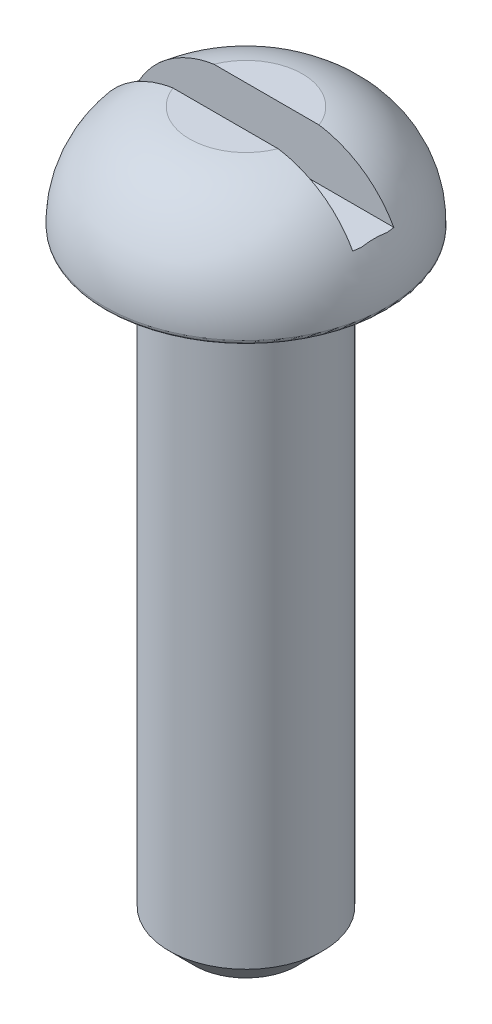
ISO-10303-21;
HEADER;
FILE_DESCRIPTION(('STEP AP214'),'2;1');
FILE_NAME('part.step','',(''),(''),'','','');
FILE_SCHEMA(('AUTOMOTIVE_DESIGN { 1 0 10303 214 1 1 1 1 }'));
ENDSEC;
DATA;
#1=APPLICATION_CONTEXT('core data for automotive mechanical design processes');
#2=APPLICATION_PROTOCOL_DEFINITION('international standard','automotive_design',2000,#1);
#3=PRODUCT_CONTEXT('',#1,'mechanical');
#4=PRODUCT('Part','Part','',(#3));
#5=PRODUCT_RELATED_PRODUCT_CATEGORY('part','',(#4));
#6=PRODUCT_DEFINITION_FORMATION('','',#4);
#7=PRODUCT_DEFINITION_CONTEXT('part definition',#1,'design');
#8=PRODUCT_DEFINITION('design','',#6,#7);
#9=PRODUCT_DEFINITION_SHAPE('','',#8);
#10=(LENGTH_UNIT() NAMED_UNIT(*) SI_UNIT(.MILLI.,.METRE.));
#11=(NAMED_UNIT(*) PLANE_ANGLE_UNIT() SI_UNIT($,.RADIAN.));
#12=(NAMED_UNIT(*) SI_UNIT($,.STERADIAN.) SOLID_ANGLE_UNIT());
#13=UNCERTAINTY_MEASURE_WITH_UNIT(LENGTH_MEASURE(1.E-05),#10,'distance_accuracy_value','');
#14=(GEOMETRIC_REPRESENTATION_CONTEXT(3) GLOBAL_UNCERTAINTY_ASSIGNED_CONTEXT((#13)) GLOBAL_UNIT_ASSIGNED_CONTEXT((#10,
#11,#12)) REPRESENTATION_CONTEXT('',''));
#15=CARTESIAN_POINT('',(0.,0.,0.));
#16=DIRECTION('',(0.,0.,1.));
#17=DIRECTION('',(1.,0.,0.));
#18=AXIS2_PLACEMENT_3D('',#15,#16,#17);
#19=CARTESIAN_POINT('',(0.,14.,0.));
#20=DIRECTION('',(0.,1.,0.));
#21=DIRECTION('',(0.,0.,1.));
#22=AXIS2_PLACEMENT_3D('',#19,#20,#21);
#23=PLANE('',#22);
#24=DIRECTION('',(-1.,0.,0.));
#25=VECTOR('',#24,1.);
#26=CARTESIAN_POINT('',(-2.5,14.,-0.4));
#27=LINE('',#26,#25);
#28=CARTESIAN_POINT('',(1.02469507659595,14.,-0.4));
#29=VERTEX_POINT('',#28);
#30=CARTESIAN_POINT('',(-1.02469507659595,14.,-0.4));
#31=VERTEX_POINT('',#30);
#32=EDGE_CURVE('E95',#29,#31,#27,.T.);
#33=ORIENTED_EDGE('',*,*,#32,.F.);
#34=CARTESIAN_POINT('',(0.,14.,0.));
#35=DIRECTION('',(0.,-1.,0.));
#36=DIRECTION('',(0.,0.,-1.));
#37=AXIS2_PLACEMENT_3D('',#34,#35,#36);
#38=CIRCLE('',#37,1.1);
#39=EDGE_CURVE('E101',#31,#29,#38,.T.);
#40=ORIENTED_EDGE('',*,*,#39,.F.);
#41=EDGE_LOOP('',(#33,#40));
#42=FACE_BOUND('',#41,.T.);
#43=ADVANCED_FACE('F29',(#42),#23,.T.);
#44=CARTESIAN_POINT('',(1.,0.,0.));
#45=DIRECTION('',(0.,-1.,0.));
#46=DIRECTION('',(0.,0.,-1.));
#47=AXIS2_PLACEMENT_3D('',#44,#45,#46);
#48=PLANE('',#47);
#49=CARTESIAN_POINT('',(0.,0.,0.));
#50=DIRECTION('',(0.,-1.,0.));
#51=DIRECTION('',(0.,0.,-1.));
#52=AXIS2_PLACEMENT_3D('',#49,#50,#51);
#53=CIRCLE('',#52,1.);
#54=CARTESIAN_POINT('',(0.,0.,-1.));
#55=VERTEX_POINT('',#54);
#56=EDGE_CURVE('E223',#55,#55,#53,.T.);
#57=ORIENTED_EDGE('',*,*,#56,.T.);
#58=EDGE_LOOP('',(#57));
#59=FACE_BOUND('',#58,.T.);
#60=ADVANCED_FACE('F31',(#59),#48,.T.);
#61=DIRECTION('',(1.,0.,0.));
#62=VECTOR('',#61,1.);
#63=CARTESIAN_POINT('',(-2.5,14.,0.4));
#64=LINE('',#63,#62);
#65=CARTESIAN_POINT('',(-1.02469507659595,14.,0.4));
#66=VERTEX_POINT('',#65);
#67=CARTESIAN_POINT('',(1.02469507659595,14.,0.4));
#68=VERTEX_POINT('',#67);
#69=EDGE_CURVE('E87',#66,#68,#64,.T.);
#70=ORIENTED_EDGE('',*,*,#69,.F.);
#71=EDGE_CURVE('E94',#68,#66,#38,.T.);
#72=ORIENTED_EDGE('',*,*,#71,.F.);
#73=EDGE_LOOP('',(#70,#72));
#74=FACE_BOUND('',#73,.T.);
#75=ADVANCED_FACE('F93',(#74),#23,.T.);
#76=CARTESIAN_POINT('',(0.,12.050099776341,0.));
#77=DIRECTION('',(0.,-1.,0.));
#78=DIRECTION('',(0.,0.,-1.));
#79=AXIS2_PLACEMENT_3D('',#76,#77,#78);
#80=DEGENERATE_TOROIDAL_SURFACE('',#79,0.779672442615777,1.97603659537097,.T.);
#81=CARTESIAN_POINT('',(0.,13.9893185526949,0.4));
#82=CARTESIAN_POINT('',(0.0336322301279483,13.9893205716001,0.4));
#83=CARTESIAN_POINT('',(0.0672648143564293,13.9901784468217,0.4));
#84=CARTESIAN_POINT('',(0.134486048973814,13.9932787408374,0.4));
#85=CARTESIAN_POINT('',(0.168074638300507,13.9955223279096,0.4));
#86=CARTESIAN_POINT('',(0.235341692539278,14.000675588183,0.4));
#87=CARTESIAN_POINT('',(0.269019918116884,14.0035880994358,0.4));
#88=CARTESIAN_POINT('',(0.336378018840054,14.0093648088338,0.4));
#89=CARTESIAN_POINT('',(0.370057893639487,14.0122290108159,0.4));
#90=CARTESIAN_POINT('',(0.437877287244912,14.0174111816535,0.4));
#91=CARTESIAN_POINT('',(0.472017389468459,14.0197220409397,0.4));
#92=CARTESIAN_POINT('',(0.540348220697959,14.0233824621022,0.4));
#93=CARTESIAN_POINT('',(0.574538947867759,14.024732058027,0.4));
#94=CARTESIAN_POINT('',(0.677147719963299,14.0269491128557,0.4));
#95=CARTESIAN_POINT('',(0.745623445649574,14.0259868039846,0.4));
#96=CARTESIAN_POINT('',(0.881972396232885,14.0181001103437,0.4));
#97=CARTESIAN_POINT('',(0.949846939653068,14.0112000935624,0.4));
#98=CARTESIAN_POINT('',(1.08464932382839,13.991052747799,0.4));
#99=CARTESIAN_POINT('',(1.1515770535867,13.9778046808679,0.4));
#100=CARTESIAN_POINT('',(1.32743905883569,13.9338998713499,0.4));
#101=CARTESIAN_POINT('',(1.43501246700903,13.8975241731368,0.4));
#102=CARTESIAN_POINT('',(1.64277375092832,13.8071409643015,0.4));
#103=CARTESIAN_POINT('',(1.74294278143891,13.7530902425877,0.4));
#104=CARTESIAN_POINT('',(1.93265776354999,13.6286817859467,0.4));
#105=CARTESIAN_POINT('',(2.02220009208707,13.5583185134356,0.4));
#106=CARTESIAN_POINT('',(2.18779655682164,13.4033275008754,0.4));
#107=CARTESIAN_POINT('',(2.26386325268286,13.3187131882393,0.4));
#108=CARTESIAN_POINT('',(2.39887936251544,13.1395132914902,0.4));
#109=CARTESIAN_POINT('',(2.4581485407167,13.0451684721683,0.4));
#110=CARTESIAN_POINT('',(2.55988756159558,12.8477855070151,0.4));
#111=CARTESIAN_POINT('',(2.60235359515437,12.7447453964566,0.4));
#112=CARTESIAN_POINT('',(2.66896720325158,12.5337422855212,0.4));
#113=CARTESIAN_POINT('',(2.69324730817994,12.4258211017661,0.4));
#114=CARTESIAN_POINT('',(2.72329499940504,12.2074482378214,0.4));
#115=CARTESIAN_POINT('',(2.72906565960174,12.096996980875,0.4));
#116=CARTESIAN_POINT('',(2.72194370625239,11.8769623688357,0.4));
#117=CARTESIAN_POINT('',(2.70909546504866,11.7673775740258,0.4));
#118=CARTESIAN_POINT('',(2.66518054080641,11.5518857114062,0.4));
#119=CARTESIAN_POINT('',(2.63410816106256,11.4459798045542,0.4));
#120=CARTESIAN_POINT('',(2.55461964830542,11.2408306457122,0.4));
#121=CARTESIAN_POINT('',(2.50619477197843,11.1415907824946,0.4));
#122=CARTESIAN_POINT('',(2.39346155608862,10.952730884082,0.4));
#123=CARTESIAN_POINT('',(2.32917055267638,10.8631005013887,0.4));
#124=CARTESIAN_POINT('',(2.18644835327305,10.6957164743583,0.4));
#125=CARTESIAN_POINT('',(2.10799740164992,10.6179797073024,0.4));
#126=CARTESIAN_POINT('',(1.93891521729074,10.4763707060294,0.4));
#127=CARTESIAN_POINT('',(1.848242283131,10.4125479889316,0.4));
#128=CARTESIAN_POINT('',(1.70483704950054,10.3284535397504,0.4));
#129=CARTESIAN_POINT('',(1.65548996211768,10.3022428223578,0.4));
#130=CARTESIAN_POINT('',(1.55478898942817,10.2540199909275,0.4));
#131=CARTESIAN_POINT('',(1.50343572310356,10.232006593994,0.4));
#132=CARTESIAN_POINT('',(1.39961052954736,10.1924848989193,0.4));
#133=CARTESIAN_POINT('',(1.347154703557,10.1749341704784,0.4));
#134=CARTESIAN_POINT('',(1.24096668900781,10.144087442157,0.4));
#135=CARTESIAN_POINT('',(1.18723349557358,10.1307949196762,0.4));
#136=CARTESIAN_POINT('',(1.06403178522895,10.105409251435,0.4));
#137=CARTESIAN_POINT('',(0.994285023188469,10.0946421646372,0.4));
#138=CARTESIAN_POINT('',(0.88922111766015,10.0834683145864,0.4));
#139=CARTESIAN_POINT('',(0.854144078017139,10.0805733737857,0.4));
#140=CARTESIAN_POINT('',(0.783890511350773,10.0763542743213,0.4));
#141=CARTESIAN_POINT('',(0.748713977069513,10.0750302333769,0.4));
#142=CARTESIAN_POINT('',(0.677638959238751,10.0738276664905,0.4));
#143=CARTESIAN_POINT('',(0.641740038461025,10.0739784290901,0.4));
#144=CARTESIAN_POINT('',(0.569980696305413,10.0756063795703,0.4));
#145=CARTESIAN_POINT('',(0.5341202696723,10.0770833545146,0.4));
#146=CARTESIAN_POINT('',(0.462484408653194,10.0810718468225,0.4));
#147=CARTESIAN_POINT('',(0.426708933647413,10.0835826767192,0.4));
#148=CARTESIAN_POINT('',(0.355202454218474,10.0891910628304,0.4));
#149=CARTESIAN_POINT('',(0.319471456309091,10.0922886966696,0.4));
#150=CARTESIAN_POINT('',(0.242092989679417,10.0989153704634,0.4));
#151=CARTESIAN_POINT('',(0.200444216725497,10.102431044494,0.4));
#152=CARTESIAN_POINT('',(0.117048492487854,10.1079387604799,0.4));
#153=CARTESIAN_POINT('',(0.075301601320351,10.109931570048,0.4));
#154=CARTESIAN_POINT('',(-0.00826329739638212,10.1112825106585,0.4));
#155=CARTESIAN_POINT('',(-0.0500813291633589,10.1106394017257,0.4));
#156=CARTESIAN_POINT('',(-0.13363965362679,10.107103381295,0.4));
#157=CARTESIAN_POINT('',(-0.175379845783711,10.1042084942558,0.4));
#158=CARTESIAN_POINT('',(-0.258750304049262,10.0975943400043,0.4));
#159=CARTESIAN_POINT('',(-0.300380631753039,10.0938757412807,0.4));
#160=CARTESIAN_POINT('',(-0.383666399543676,10.086876174696,0.4));
#161=CARTESIAN_POINT('',(-0.425321824593191,10.0835950450587,0.4));
#162=CARTESIAN_POINT('',(-0.508683231706566,10.0782963358118,0.4));
#163=CARTESIAN_POINT('',(-0.550389134860359,10.0762776249953,0.4));
#164=CARTESIAN_POINT('',(-0.633847536707203,10.0739944667312,0.4));
#165=CARTESIAN_POINT('',(-0.675600033238118,10.0737299410122,0.4));
#166=CARTESIAN_POINT('',(-0.79827955404351,10.0759998570305,0.4));
#167=CARTESIAN_POINT('',(-0.879185473529185,10.0813950893823,0.4));
#168=CARTESIAN_POINT('',(-1.04009545442691,10.1010893630931,0.4));
#169=CARTESIAN_POINT('',(-1.12009731292896,10.1154067359856,0.4));
#170=CARTESIAN_POINT('',(-1.27744036603234,10.1531371767776,0.4));
#171=CARTESIAN_POINT('',(-1.35479443169428,10.1764963080498,0.4));
#172=CARTESIAN_POINT('',(-1.50607354050175,10.2322003727284,0.4));
#173=CARTESIAN_POINT('',(-1.58000406828909,10.2645303092733,0.4));
#174=CARTESIAN_POINT('',(-1.70066637437019,10.3262016445704,0.4));
#175=CARTESIAN_POINT('',(-1.74858977096687,10.3532405563336,0.4));
#176=CARTESIAN_POINT('',(-1.84204738578037,10.4111970567725,0.4));
#177=CARTESIAN_POINT('',(-1.88758126390444,10.4421151954546,0.4));
#178=CARTESIAN_POINT('',(-1.97648927226605,10.5080550455863,0.4));
#179=CARTESIAN_POINT('',(-2.01982815044717,10.5431243634134,0.4));
#180=CARTESIAN_POINT('',(-2.10337243061363,10.6167808584538,0.4));
#181=CARTESIAN_POINT('',(-2.14357835593785,10.655367445784,0.4));
#182=CARTESIAN_POINT('',(-2.25876075366804,10.7757272034825,0.4));
#183=CARTESIAN_POINT('',(-2.32872619866147,10.8624156004796,0.4));
#184=CARTESIAN_POINT('',(-2.45273016359906,11.0459448693481,0.4));
#185=CARTESIAN_POINT('',(-2.50683160667454,11.142743507888,0.4));
#186=CARTESIAN_POINT('',(-2.59789639376449,11.3439330360895,0.4));
#187=CARTESIAN_POINT('',(-2.63488542916092,11.4483122703698,0.4));
#188=CARTESIAN_POINT('',(-2.69078481684572,11.661927136349,0.4));
#189=CARTESIAN_POINT('',(-2.70967494073831,11.7711680594468,0.4));
#190=CARTESIAN_POINT('',(-2.72872049994938,11.9908395059784,0.4));
#191=CARTESIAN_POINT('',(-2.72894896278393,12.1012637009852,0.4));
#192=CARTESIAN_POINT('',(-2.71085046679965,12.3205454982234,0.4));
#193=CARTESIAN_POINT('',(-2.69252940318256,12.4294035870292,0.4));
#194=CARTESIAN_POINT('',(-2.6378866049697,12.6424370075217,0.4));
#195=CARTESIAN_POINT('',(-2.60157509032429,12.7466149612779,0.4));
#196=CARTESIAN_POINT('',(-2.51199794489189,12.9474252587672,0.4));
#197=CARTESIAN_POINT('',(-2.4587296513187,13.0440564144285,0.4));
#198=CARTESIAN_POINT('',(-2.33667666099482,13.2271964801785,0.4));
#199=CARTESIAN_POINT('',(-2.26786608902612,13.3136881407663,0.4));
#200=CARTESIAN_POINT('',(-2.11678830197833,13.4739363806434,0.4));
#201=CARTESIAN_POINT('',(-2.03452512343719,13.5476967664261,0.4));
#202=CARTESIAN_POINT('',(-1.85845680132228,13.6808768253943,0.4));
#203=CARTESIAN_POINT('',(-1.76459390280117,13.7402199873493,0.4));
#204=CARTESIAN_POINT('',(-1.56825068819723,13.8426259986815,0.4));
#205=CARTESIAN_POINT('',(-1.46576450258916,13.8856776476967,0.4));
#206=CARTESIAN_POINT('',(-1.30705768686086,13.9376774159837,0.4));
#207=CARTESIAN_POINT('',(-1.25283407094746,13.9529905421259,0.4));
#208=CARTESIAN_POINT('',(-1.14331010617465,13.9791983631637,0.4));
#209=CARTESIAN_POINT('',(-1.08800961915715,13.9900924871533,0.4));
#210=CARTESIAN_POINT('',(-0.97681174003832,14.0075176170994,0.4));
#211=CARTESIAN_POINT('',(-0.920915266039606,14.0140545600937,0.4));
#212=CARTESIAN_POINT('',(-0.808825447819273,14.0230046821046,0.4));
#213=CARTESIAN_POINT('',(-0.752632245417657,14.0254196787798,0.4));
#214=CARTESIAN_POINT('',(-0.638202420490308,14.0265954454027,0.4));
#215=CARTESIAN_POINT('',(-0.579964874932429,14.0252218904068,0.4));
#216=CARTESIAN_POINT('',(-0.463602771262394,14.0194855430093,0.4));
#217=CARTESIAN_POINT('',(-0.405478390226043,14.015119687082,0.4));
#218=CARTESIAN_POINT('',(-0.318466264025565,14.0078602606046,0.4));
#219=CARTESIAN_POINT('',(-0.289542668712639,14.0053271525568,0.4));
#220=CARTESIAN_POINT('',(-0.231677824652645,14.0004358120315,0.4));
#221=CARTESIAN_POINT('',(-0.202736575195302,13.998077587132,0.4));
#222=CARTESIAN_POINT('',(-0.144850436771999,13.9940084600175,0.4));
#223=CARTESIAN_POINT('',(-0.115905623626885,13.9922965556835,0.4));
#224=CARTESIAN_POINT('',(-0.0579739548392685,13.9899508415462,0.4));
#225=CARTESIAN_POINT('',(-0.0289871089406208,13.9893168126311,0.4));
#226=CARTESIAN_POINT('',(0.,13.9893185526949,0.4));
#227=B_SPLINE_CURVE_WITH_KNOTS('',3,(#81,#82,#83,#84,#85,#86,#87,#88,#89,#90,#91,#92,#93,#94,
#95,#96,#97,#98,#99,#100,#101,#102,#103,#104,#105,#106,#107,#108,#109,#110,#111,#112,#113,#114,
#115,#116,#117,#118,#119,#120,#121,#122,#123,#124,#125,#126,#127,#128,#129,#130,#131,#132,#133,
#134,#135,#136,#137,#138,#139,#140,#141,#142,#143,#144,#145,#146,#147,#148,#149,#150,#151,#152,
#153,#154,#155,#156,#157,#158,#159,#160,#161,#162,#163,#164,#165,#166,#167,#168,#169,#170,#171,
#172,#173,#174,#175,#176,#177,#178,#179,#180,#181,#182,#183,#184,#185,#186,#187,#188,#189,#190,
#191,#192,#193,#194,#195,#196,#197,#198,#199,#200,#201,#202,#203,#204,#205,#206,#207,#208,#209,
#210,#211,#212,#213,#214,#215,#216,#217,#218,#219,#220,#221,#222,#223,#224,#225,#226),
.UNSPECIFIED.,.T.,.F.,(4,2,2,2,2,2,2,2,2,2,2,2,2,2,2,2,2,2,2,2,2,2,2,2,2,2,2,2,2,2,2,2,2,2,2,2,
2,2,2,2,2,2,2,2,2,2,2,2,2,2,2,2,2,2,2,2,2,2,2,2,2,2,2,2,2,2,2,2,2,2,2,2,4),(0.,
0.100890023684147,0.20186522294138,0.303277014523181,0.404680713008293,0.507324699032976,
0.60996504917535,0.815182329830902,1.01956140617602,1.2239642469793,1.56297001300182,
1.9028108396941,2.24276720072985,2.58240502666488,2.91506020623248,3.24779075253564,
3.57807227226821,3.90829893865739,4.23773990589671,4.56728390841,4.89699419059368,
5.22634579707032,5.55616050998683,5.88713046661353,6.05459853805702,6.22201534115169,
6.38777523813919,6.55367015739326,6.76501012148145,6.87057116918615,6.97614012686717,
7.08380979826551,7.19146218533486,7.29904310373739,7.40663826332749,7.53202567740017,
7.65734984711895,7.78273297795787,7.90822623480996,8.03361801752365,8.15896330091039,
8.28419610546769,8.40942332211286,8.65221314412578,8.89550345712298,9.13736430175846,
9.37882322878398,9.54372519059966,9.70865055909821,9.87569425907157,10.0427099954235,
10.3751757055228,10.7063043070526,11.0369341487598,11.3679330920178,11.6976366954212,
12.0272355490161,12.3566473796013,12.6861109644933,13.0161271461231,13.346044485437,
13.6776761947942,14.0095354874336,14.178415684656,14.3473176931479,14.5159890849235,
14.6845860782746,14.8592368371135,15.0340666714876,15.1211717845946,15.2082806699839,
15.2952539330296,15.3822095139242),.UNSPECIFIED.);
#228=CARTESIAN_POINT('',(-2.48037267208639,13.,0.4));
#229=VERTEX_POINT('',#228);
#230=EDGE_CURVE('E11',#229,#66,#227,.T.);
#231=ORIENTED_EDGE('',*,*,#230,.F.);
#232=CARTESIAN_POINT('',(0.,13.,0.));
#233=DIRECTION('',(0.,1.,0.));
#234=DIRECTION('',(0.,0.,1.));
#235=AXIS2_PLACEMENT_3D('',#232,#233,#234);
#236=CIRCLE('',#235,2.51241887280624);
#237=CARTESIAN_POINT('',(-2.5,13.,0.24949667820031));
#238=VERTEX_POINT('',#237);
#239=EDGE_CURVE('E42',#229,#238,#236,.F.);
#240=ORIENTED_EDGE('',*,*,#239,.T.);
#241=CARTESIAN_POINT('',(-2.5,13.0223105156098,0.));
#242=CARTESIAN_POINT('',(-2.5,13.0223101461313,0.0712306788425635));
#243=CARTESIAN_POINT('',(-2.5,13.0169240888941,0.142558865114006));
#244=CARTESIAN_POINT('',(-2.5,12.9952483334499,0.283701712225145));
#245=CARTESIAN_POINT('',(-2.5,12.9789301875964,0.353511932388625));
#246=CARTESIAN_POINT('',(-2.5,12.9350344874374,0.489880588433877));
#247=CARTESIAN_POINT('',(-2.5,12.9074101065493,0.556424195769018));
#248=CARTESIAN_POINT('',(-2.5,12.8407369512236,0.683471035223089));
#249=CARTESIAN_POINT('',(-2.5,12.8017106646115,0.743985845778091));
#250=CARTESIAN_POINT('',(-2.5,12.7227307863145,0.843275760575029));
#251=CARTESIAN_POINT('',(-2.5,12.6850407746805,0.883854319520758));
#252=CARTESIAN_POINT('',(-2.5,12.6034539698896,0.958249349802386));
#253=CARTESIAN_POINT('',(-2.5,12.5595595433445,0.992068387670541));
#254=CARTESIAN_POINT('',(-2.5,12.466145410668,1.0515647045904));
#255=CARTESIAN_POINT('',(-2.5,12.4165933380393,1.07719158850154));
#256=CARTESIAN_POINT('',(-2.5,12.3135136440282,1.11857305743128));
#257=CARTESIAN_POINT('',(-2.5,12.2599883621531,1.13433340129616));
#258=CARTESIAN_POINT('',(-2.5,12.1568447126333,1.15387563353978));
#259=CARTESIAN_POINT('',(-2.5,12.1074364619562,1.15877596536218));
#260=CARTESIAN_POINT('',(-2.5,12.0085452840721,1.15971101314125));
#261=CARTESIAN_POINT('',(-2.5,11.9590623920535,1.15574907177317));
#262=CARTESIAN_POINT('',(-2.5,11.8641185155025,1.13961207805656));
#263=CARTESIAN_POINT('',(-2.5,11.8185820862839,1.12787399445516));
#264=CARTESIAN_POINT('',(-2.5,11.7300259482908,1.09717394472953));
#265=CARTESIAN_POINT('',(-2.5,11.6870063765887,1.07821158558015));
#266=CARTESIAN_POINT('',(-2.5,11.602974014653,1.03306389528727));
#267=CARTESIAN_POINT('',(-2.5,11.5620868851607,1.00664580851613));
#268=CARTESIAN_POINT('',(-2.5,11.4847867197529,0.947939477777543));
#269=CARTESIAN_POINT('',(-2.5,11.4483752369431,0.915649205671529));
#270=CARTESIAN_POINT('',(-2.5,11.3768841506192,0.842566073313486));
#271=CARTESIAN_POINT('',(-2.5,11.3423568726614,0.801234383081301));
#272=CARTESIAN_POINT('',(-2.5,11.2796399023452,0.714029036243395));
#273=CARTESIAN_POINT('',(-2.5,11.2514534775994,0.668153055300622));
#274=CARTESIAN_POINT('',(-2.5,11.1976264083185,0.56570561158647));
#275=CARTESIAN_POINT('',(-2.5,11.1730492589374,0.508575952252562));
#276=CARTESIAN_POINT('',(-2.5,11.1323220574934,0.391397341288987));
#277=CARTESIAN_POINT('',(-2.5,11.1161769208644,0.33134670912605));
#278=CARTESIAN_POINT('',(-2.5,11.0902112979717,0.199724484838879));
#279=CARTESIAN_POINT('',(-2.5,11.0818421784008,0.127864571020887));
#280=CARTESIAN_POINT('',(-2.5,11.0761381430047,-0.0163393775210938));
#281=CARTESIAN_POINT('',(-2.5,11.0788140197515,-0.0886838167684121));
#282=CARTESIAN_POINT('',(-2.5,11.0960418651365,-0.238852141273037));
#283=CARTESIAN_POINT('',(-2.5,11.1116819092154,-0.316555155132488));
#284=CARTESIAN_POINT('',(-2.5,11.1565453792341,-0.467928327990441));
#285=CARTESIAN_POINT('',(-2.5,11.1857522182913,-0.541603289127116));
#286=CARTESIAN_POINT('',(-2.5,11.2496625973163,-0.66574365016099));
#287=CARTESIAN_POINT('',(-2.5,11.2815645966084,-0.717654202163197));
#288=CARTESIAN_POINT('',(-2.5,11.3534783502318,-0.815560730450136));
#289=CARTESIAN_POINT('',(-2.5,11.3934864005324,-0.861559392517834));
#290=CARTESIAN_POINT('',(-2.5,11.4814846868964,-0.94600006669602));
#291=CARTESIAN_POINT('',(-2.5,11.5295346361276,-0.984380466316215));
#292=CARTESIAN_POINT('',(-2.5,11.6322573046179,-1.05096309856745));
#293=CARTESIAN_POINT('',(-2.5,11.6869239497771,-1.07917457297966));
#294=CARTESIAN_POINT('',(-2.5,11.7930703954801,-1.12047369115394));
#295=CARTESIAN_POINT('',(-2.5,11.8439487014708,-1.1351112921511));
#296=CARTESIAN_POINT('',(-2.5,11.9475396282018,-1.15459744549458));
#297=CARTESIAN_POINT('',(-2.5,12.0002509150112,-1.15945297101361));
#298=CARTESIAN_POINT('',(-2.5,12.1004596648121,-1.15911656356735));
#299=CARTESIAN_POINT('',(-2.5,12.1479629496431,-1.1548606781451));
#300=CARTESIAN_POINT('',(-2.5,12.2415555906014,-1.13837987259776));
#301=CARTESIAN_POINT('',(-2.5,12.2876451456364,-1.12615607896912));
#302=CARTESIAN_POINT('',(-2.5,12.3769476336827,-1.09439743039534));
#303=CARTESIAN_POINT('',(-2.5,12.420174022329,-1.07490012929803));
#304=CARTESIAN_POINT('',(-2.5,12.5030503419432,-1.02941245372523));
#305=CARTESIAN_POINT('',(-2.5,12.5426993791683,-1.00342046273776));
#306=CARTESIAN_POINT('',(-2.5,12.6205513651631,-0.943733525554367));
#307=CARTESIAN_POINT('',(-2.5,12.6584219937318,-0.909606632222674));
#308=CARTESIAN_POINT('',(-2.5,12.7287175103071,-0.836166720546383));
#309=CARTESIAN_POINT('',(-2.5,12.7611406259582,-0.796852021741521));
#310=CARTESIAN_POINT('',(-2.5,12.8242870729129,-0.708603935542906));
#311=CARTESIAN_POINT('',(-2.5,12.854194677086,-0.659088099147599));
#312=CARTESIAN_POINT('',(-2.5,12.9066444999432,-0.55627314214371));
#313=CARTESIAN_POINT('',(-2.5,12.9291784094697,-0.50296983529722));
#314=CARTESIAN_POINT('',(-2.5,12.9700907472227,-0.384754626029004));
#315=CARTESIAN_POINT('',(-2.5,12.9871515513999,-0.319388131208309));
#316=CARTESIAN_POINT('',(-2.5,13.0115049400841,-0.186964805934881));
#317=CARTESIAN_POINT('',(-2.5,13.0188140967823,-0.11991104101967));
#318=CARTESIAN_POINT('',(-2.5,13.0219821685527,-0.035179551758617));
#319=CARTESIAN_POINT('',(-2.5,13.0223106068647,-0.0175927498795484));
#320=CARTESIAN_POINT('',(-2.5,13.0223105156098,0.));
#321=B_SPLINE_CURVE_WITH_KNOTS('',3,(#241,#242,#243,#244,#245,#246,#247,#248,#249,#250,#251,
#252,#253,#254,#255,#256,#257,#258,#259,#260,#261,#262,#263,#264,#265,#266,#267,#268,#269,#270,
#271,#272,#273,#274,#275,#276,#277,#278,#279,#280,#281,#282,#283,#284,#285,#286,#287,#288,#289,
#290,#291,#292,#293,#294,#295,#296,#297,#298,#299,#300,#301,#302,#303,#304,#305,#306,#307,#308,
#309,#310,#311,#312,#313,#314,#315,#316,#317,#318,#319,#320),.UNSPECIFIED.,.T.,.F.,(4,2,2,2,2,2,
2,2,2,2,2,2,2,2,2,2,2,2,2,2,2,2,2,2,2,2,2,2,2,2,2,2,2,2,2,2,2,2,2,4),(0.,0.213654058428576,
0.427866261467032,0.642974783844954,0.857661882047724,1.02313256849238,1.18854030728179,
1.35494682143161,1.52125611759126,1.6694369131548,1.81756182725976,1.95799843379395,
2.09844268164834,2.24387837543208,2.38936439560361,2.55030448513531,2.71132732241044,
2.89719032712376,3.08316155989775,3.29930936619596,3.51566843039356,3.7522771145924,
3.98859727727576,4.17066050848427,4.35264073342777,4.53603759006511,4.71926734814893,
4.87720820490713,5.03503643330442,5.17743169042945,5.31980682019252,5.46145680385799,
5.60314207902791,5.75546979409161,5.90784697360662,6.08072712684902,6.25380142712087,
6.45570811901972,6.65727124675774,6.71004011646053),.UNSPECIFIED.);
#322=CARTESIAN_POINT('',(-2.5,13.,-0.24949667820031));
#323=VERTEX_POINT('',#322);
#324=EDGE_CURVE('E33',#323,#238,#321,.T.);
#325=ORIENTED_EDGE('',*,*,#324,.F.);
#326=CARTESIAN_POINT('',(-2.48037267208639,13.,-0.4));
#327=VERTEX_POINT('',#326);
#328=EDGE_CURVE('E202',#323,#327,#236,.F.);
#329=ORIENTED_EDGE('',*,*,#328,.T.);
#330=CARTESIAN_POINT('',(0.,13.9893185526949,-0.4));
#331=CARTESIAN_POINT('',(-0.0336322301279488,13.9893205716001,-0.4));
#332=CARTESIAN_POINT('',(-0.0672648143564298,13.9901784468217,-0.4));
#333=CARTESIAN_POINT('',(-0.134486048973815,13.9932787408374,-0.4));
#334=CARTESIAN_POINT('',(-0.168074638300507,13.9955223279096,-0.4));
#335=CARTESIAN_POINT('',(-0.235341692539279,14.000675588183,-0.4));
#336=CARTESIAN_POINT('',(-0.269019918116885,14.0035880994358,-0.4));
#337=CARTESIAN_POINT('',(-0.336378018840054,14.0093648088338,-0.4));
#338=CARTESIAN_POINT('',(-0.370057893639488,14.0122290108159,-0.4));
#339=CARTESIAN_POINT('',(-0.437877287244913,14.0174111816535,-0.4));
#340=CARTESIAN_POINT('',(-0.47201738946846,14.0197220409397,-0.4));
#341=CARTESIAN_POINT('',(-0.54034822069796,14.0233824621022,-0.4));
#342=CARTESIAN_POINT('',(-0.574538947867761,14.024732058027,-0.4));
#343=CARTESIAN_POINT('',(-0.6771477199633,14.0269491128557,-0.4));
#344=CARTESIAN_POINT('',(-0.745623445649576,14.0259868039846,-0.4));
#345=CARTESIAN_POINT('',(-0.881972396232887,14.0181001103437,-0.4));
#346=CARTESIAN_POINT('',(-0.949846939653069,14.0112000935624,-0.4));
#347=CARTESIAN_POINT('',(-1.08464932382839,13.991052747799,-0.4));
#348=CARTESIAN_POINT('',(-1.1515770535867,13.9778046808679,-0.4));
#349=CARTESIAN_POINT('',(-1.3274390588357,13.9338998713499,-0.4));
#350=CARTESIAN_POINT('',(-1.43501246700903,13.8975241731368,-0.4));
#351=CARTESIAN_POINT('',(-1.64277375092832,13.8071409643015,-0.4));
#352=CARTESIAN_POINT('',(-1.74294278143891,13.7530902425877,-0.4));
#353=CARTESIAN_POINT('',(-1.93265776354999,13.6286817859467,-0.4));
#354=CARTESIAN_POINT('',(-2.02220009208707,13.5583185134356,-0.4));
#355=CARTESIAN_POINT('',(-2.18779655682164,13.4033275008754,-0.4));
#356=CARTESIAN_POINT('',(-2.26386325268286,13.3187131882393,-0.4));
#357=CARTESIAN_POINT('',(-2.39887936251544,13.1395132914902,-0.4));
#358=CARTESIAN_POINT('',(-2.4581485407167,13.0451684721683,-0.4));
#359=CARTESIAN_POINT('',(-2.55988756159558,12.8477855070151,-0.4));
#360=CARTESIAN_POINT('',(-2.60235359515437,12.7447453964566,-0.4));
#361=CARTESIAN_POINT('',(-2.66896720325158,12.5337422855212,-0.4));
#362=CARTESIAN_POINT('',(-2.69324730817994,12.4258211017661,-0.4));
#363=CARTESIAN_POINT('',(-2.72329499940504,12.2074482378214,-0.4));
#364=CARTESIAN_POINT('',(-2.72906565960174,12.096996980875,-0.4));
#365=CARTESIAN_POINT('',(-2.72194370625239,11.8769623688357,-0.4));
#366=CARTESIAN_POINT('',(-2.70909546504866,11.7673775740258,-0.4));
#367=CARTESIAN_POINT('',(-2.66518054080641,11.5518857114062,-0.4));
#368=CARTESIAN_POINT('',(-2.63410816106256,11.4459798045542,-0.4));
#369=CARTESIAN_POINT('',(-2.55461964830541,11.2408306457122,-0.4));
#370=CARTESIAN_POINT('',(-2.50619477197843,11.1415907824946,-0.4));
#371=CARTESIAN_POINT('',(-2.39346155608861,10.952730884082,-0.4));
#372=CARTESIAN_POINT('',(-2.32917055267637,10.8631005013886,-0.4));
#373=CARTESIAN_POINT('',(-2.18644835327305,10.6957164743583,-0.4));
#374=CARTESIAN_POINT('',(-2.10799740164992,10.6179797073024,-0.4));
#375=CARTESIAN_POINT('',(-1.93891521729073,10.4763707060294,-0.4));
#376=CARTESIAN_POINT('',(-1.848242283131,10.4125479889316,-0.4));
#377=CARTESIAN_POINT('',(-1.70483704950054,10.3284535397504,-0.4));
#378=CARTESIAN_POINT('',(-1.65548996211767,10.3022428223578,-0.4));
#379=CARTESIAN_POINT('',(-1.55478898942816,10.2540199909275,-0.4));
#380=CARTESIAN_POINT('',(-1.50343572310356,10.232006593994,-0.4));
#381=CARTESIAN_POINT('',(-1.39961052954736,10.1924848989193,-0.4));
#382=CARTESIAN_POINT('',(-1.347154703557,10.1749341704784,-0.4));
#383=CARTESIAN_POINT('',(-1.2409666890078,10.144087442157,-0.4));
#384=CARTESIAN_POINT('',(-1.18723349557358,10.1307949196762,-0.4));
#385=CARTESIAN_POINT('',(-1.06403178522895,10.105409251435,-0.4));
#386=CARTESIAN_POINT('',(-0.994285023188466,10.0946421646372,-0.4));
#387=CARTESIAN_POINT('',(-0.889221117660148,10.0834683145864,-0.4));
#388=CARTESIAN_POINT('',(-0.854144078017136,10.0805733737857,-0.4));
#389=CARTESIAN_POINT('',(-0.78389051135077,10.0763542743213,-0.4));
#390=CARTESIAN_POINT('',(-0.748713977069509,10.0750302333769,-0.4));
#391=CARTESIAN_POINT('',(-0.677638959238747,10.0738276664905,-0.4));
#392=CARTESIAN_POINT('',(-0.641740038461021,10.0739784290901,-0.4));
#393=CARTESIAN_POINT('',(-0.569980696305409,10.0756063795703,-0.4));
#394=CARTESIAN_POINT('',(-0.534120269672296,10.0770833545146,-0.4));
#395=CARTESIAN_POINT('',(-0.462484408653189,10.0810718468225,-0.4));
#396=CARTESIAN_POINT('',(-0.426708933647408,10.0835826767192,-0.4));
#397=CARTESIAN_POINT('',(-0.35520245421847,10.0891910628304,-0.4));
#398=CARTESIAN_POINT('',(-0.319471456309086,10.0922886966696,-0.4));
#399=CARTESIAN_POINT('',(-0.242092989679411,10.0989153704634,-0.4));
#400=CARTESIAN_POINT('',(-0.200444216725491,10.102431044494,-0.4));
#401=CARTESIAN_POINT('',(-0.117048492487847,10.1079387604799,-0.4));
#402=CARTESIAN_POINT('',(-0.0753016013203436,10.109931570048,-0.4));
#403=CARTESIAN_POINT('',(0.00826329739639017,10.1112825106585,-0.4));
#404=CARTESIAN_POINT('',(0.0500813291633672,10.1106394017257,-0.4));
#405=CARTESIAN_POINT('',(0.133639653626799,10.107103381295,-0.4));
#406=CARTESIAN_POINT('',(0.17537984578372,10.1042084942557,-0.4));
#407=CARTESIAN_POINT('',(0.258750304049273,10.0975943400043,-0.4));
#408=CARTESIAN_POINT('',(0.300380631753051,10.0938757412807,-0.4));
#409=CARTESIAN_POINT('',(0.383666399543689,10.086876174696,-0.4));
#410=CARTESIAN_POINT('',(0.425321824593204,10.0835950450587,-0.4));
#411=CARTESIAN_POINT('',(0.508683231706579,10.0782963358118,-0.4));
#412=CARTESIAN_POINT('',(0.550389134860373,10.0762776249953,-0.4));
#413=CARTESIAN_POINT('',(0.633847536707218,10.0739944667312,-0.4));
#414=CARTESIAN_POINT('',(0.675600033238133,10.0737299410122,-0.4));
#415=CARTESIAN_POINT('',(0.798279554043526,10.0759998570305,-0.4));
#416=CARTESIAN_POINT('',(0.879185473529202,10.0813950893823,-0.4));
#417=CARTESIAN_POINT('',(1.04009545442693,10.1010893630931,-0.4));
#418=CARTESIAN_POINT('',(1.12009731292898,10.1154067359856,-0.4));
#419=CARTESIAN_POINT('',(1.27744036603235,10.1531371767776,-0.4));
#420=CARTESIAN_POINT('',(1.3547944316943,10.1764963080498,-0.4));
#421=CARTESIAN_POINT('',(1.50607354050177,10.2322003727284,-0.4));
#422=CARTESIAN_POINT('',(1.58000406828911,10.2645303092733,-0.4));
#423=CARTESIAN_POINT('',(1.70066637437021,10.3262016445704,-0.4));
#424=CARTESIAN_POINT('',(1.74858977096689,10.3532405563336,-0.4));
#425=CARTESIAN_POINT('',(1.84204738578039,10.4111970567725,-0.4));
#426=CARTESIAN_POINT('',(1.88758126390445,10.4421151954546,-0.400000000000001));
#427=CARTESIAN_POINT('',(1.97648927226607,10.5080550455863,-0.400000000000001));
#428=CARTESIAN_POINT('',(2.01982815044719,10.5431243634134,-0.400000000000001));
#429=CARTESIAN_POINT('',(2.10337243061364,10.6167808584539,-0.400000000000001));
#430=CARTESIAN_POINT('',(2.14357835593786,10.655367445784,-0.400000000000001));
#431=CARTESIAN_POINT('',(2.25876075366805,10.7757272034825,-0.400000000000001));
#432=CARTESIAN_POINT('',(2.32872619866148,10.8624156004796,-0.400000000000001));
#433=CARTESIAN_POINT('',(2.45273016359908,11.0459448693481,-0.400000000000001));
#434=CARTESIAN_POINT('',(2.50683160667455,11.1427435078881,-0.400000000000001));
#435=CARTESIAN_POINT('',(2.5978963937645,11.3439330360896,-0.400000000000001));
#436=CARTESIAN_POINT('',(2.63488542916093,11.4483122703699,-0.400000000000001));
#437=CARTESIAN_POINT('',(2.69078481684573,11.661927136349,-0.400000000000001));
#438=CARTESIAN_POINT('',(2.70967494073831,11.7711680594468,-0.400000000000001));
#439=CARTESIAN_POINT('',(2.72872049994938,11.9908395059784,-0.400000000000001));
#440=CARTESIAN_POINT('',(2.72894896278393,12.1012637009852,-0.400000000000001));
#441=CARTESIAN_POINT('',(2.71085046679964,12.3205454982234,-0.400000000000001));
#442=CARTESIAN_POINT('',(2.69252940318256,12.4294035870293,-0.400000000000001));
#443=CARTESIAN_POINT('',(2.63788660496969,12.6424370075217,-0.400000000000001));
#444=CARTESIAN_POINT('',(2.60157509032428,12.7466149612779,-0.400000000000001));
#445=CARTESIAN_POINT('',(2.51199794489188,12.9474252587672,-0.400000000000001));
#446=CARTESIAN_POINT('',(2.45872965131869,13.0440564144285,-0.400000000000001));
#447=CARTESIAN_POINT('',(2.33667666099481,13.2271964801785,-0.400000000000001));
#448=CARTESIAN_POINT('',(2.2678660890261,13.3136881407663,-0.400000000000001));
#449=CARTESIAN_POINT('',(2.11678830197831,13.4739363806434,-0.400000000000001));
#450=CARTESIAN_POINT('',(2.03452512343718,13.5476967664261,-0.400000000000001));
#451=CARTESIAN_POINT('',(1.85845680132226,13.6808768253944,-0.400000000000001));
#452=CARTESIAN_POINT('',(1.76459390280115,13.7402199873493,-0.4));
#453=CARTESIAN_POINT('',(1.56825068819721,13.8426259986815,-0.4));
#454=CARTESIAN_POINT('',(1.46576450258914,13.8856776476967,-0.4));
#455=CARTESIAN_POINT('',(1.30705768686083,13.9376774159837,-0.4));
#456=CARTESIAN_POINT('',(1.25283407094744,13.9529905421259,-0.4));
#457=CARTESIAN_POINT('',(1.14331010617463,13.9791983631637,-0.4));
#458=CARTESIAN_POINT('',(1.08800961915713,13.9900924871533,-0.4));
#459=CARTESIAN_POINT('',(0.976811740038297,14.0075176170994,-0.4));
#460=CARTESIAN_POINT('',(0.920915266039582,14.0140545600937,-0.4));
#461=CARTESIAN_POINT('',(0.808825447819249,14.0230046821046,-0.4));
#462=CARTESIAN_POINT('',(0.752632245417634,14.0254196787798,-0.4));
#463=CARTESIAN_POINT('',(0.638202420490288,14.0265954454027,-0.4));
#464=CARTESIAN_POINT('',(0.57996487493241,14.0252218904068,-0.4));
#465=CARTESIAN_POINT('',(0.463602771262379,14.0194855430093,-0.4));
#466=CARTESIAN_POINT('',(0.405478390226029,14.015119687082,-0.4));
#467=CARTESIAN_POINT('',(0.318466264025554,14.0078602606046,-0.4));
#468=CARTESIAN_POINT('',(0.289542668712628,14.0053271525568,-0.4));
#469=CARTESIAN_POINT('',(0.231677824652636,14.0004358120315,-0.4));
#470=CARTESIAN_POINT('',(0.202736575195294,13.998077587132,-0.4));
#471=CARTESIAN_POINT('',(0.144850436771994,13.9940084600175,-0.4));
#472=CARTESIAN_POINT('',(0.115905623626882,13.9922965556835,-0.4));
#473=CARTESIAN_POINT('',(0.0579739548392669,13.9899508415462,-0.4));
#474=CARTESIAN_POINT('',(0.0289871089406197,13.9893168126311,-0.4));
#475=CARTESIAN_POINT('',(0.,13.9893185526949,-0.4));
#476=B_SPLINE_CURVE_WITH_KNOTS('',3,(#330,#331,#332,#333,#334,#335,#336,#337,#338,#339,#340,
#341,#342,#343,#344,#345,#346,#347,#348,#349,#350,#351,#352,#353,#354,#355,#356,#357,#358,#359,
#360,#361,#362,#363,#364,#365,#366,#367,#368,#369,#370,#371,#372,#373,#374,#375,#376,#377,#378,
#379,#380,#381,#382,#383,#384,#385,#386,#387,#388,#389,#390,#391,#392,#393,#394,#395,#396,#397,
#398,#399,#400,#401,#402,#403,#404,#405,#406,#407,#408,#409,#410,#411,#412,#413,#414,#415,#416,
#417,#418,#419,#420,#421,#422,#423,#424,#425,#426,#427,#428,#429,#430,#431,#432,#433,#434,#435,
#436,#437,#438,#439,#440,#441,#442,#443,#444,#445,#446,#447,#448,#449,#450,#451,#452,#453,#454,
#455,#456,#457,#458,#459,#460,#461,#462,#463,#464,#465,#466,#467,#468,#469,#470,#471,#472,#473,
#474,#475),.UNSPECIFIED.,.T.,.F.,(4,2,2,2,2,2,2,2,2,2,2,2,2,2,2,2,2,2,2,2,2,2,2,2,2,2,2,2,2,2,2,
2,2,2,2,2,2,2,2,2,2,2,2,2,2,2,2,2,2,2,2,2,2,2,2,2,2,2,2,2,2,2,2,2,2,2,2,2,2,2,2,2,4),(0.,
0.100890023684147,0.20186522294138,0.303277014523181,0.404680713008294,0.507324699032977,
0.609965049175351,0.815182329830903,1.01956140617603,1.22396424697931,1.56297001300182,
1.9028108396941,2.24276720072985,2.58240502666488,2.91506020623248,3.24779075253565,
3.57807227226821,3.90829893865739,4.23773990589672,4.56728390841,4.89699419059368,
5.22634579707032,5.55616050998683,5.88713046661354,6.05459853805703,6.22201534115169,
6.38777523813919,6.55367015739326,6.76501012148146,6.87057116918615,6.97614012686717,
7.08380979826552,7.19146218533486,7.29904310373739,7.40663826332749,7.53202567740017,
7.65734984711895,7.78273297795787,7.90822623480997,8.03361801752366,8.1589633009104,
8.28419610546771,8.40942332211287,8.65221314412579,8.895503457123,9.13736430175847,
9.378823228784,9.54372519059967,9.70865055909822,9.87569425907158,10.0427099954235,
10.3751757055228,10.7063043070527,11.0369341487598,11.3679330920179,11.6976366954212,
12.0272355490161,12.3566473796013,12.6861109644933,13.0161271461231,13.346044485437,
13.6776761947943,14.0095354874336,14.178415684656,14.3473176931479,14.5159890849235,
14.6845860782746,14.8592368371135,15.0340666714876,15.1211717845946,15.2082806699839,
15.2952539330296,15.3822095139242),.UNSPECIFIED.);
#477=EDGE_CURVE('E203',#31,#327,#476,.T.);
#478=ORIENTED_EDGE('',*,*,#477,.F.);
#479=ORIENTED_EDGE('',*,*,#39,.T.);
#480=CARTESIAN_POINT('',(2.48037267208639,13.,-0.400000000000001));
#481=VERTEX_POINT('',#480);
#482=EDGE_CURVE('E199',#481,#29,#476,.T.);
#483=ORIENTED_EDGE('',*,*,#482,.F.);
#484=CARTESIAN_POINT('',(2.5,13.,-0.249496678200316));
#485=VERTEX_POINT('',#484);
#486=EDGE_CURVE('E114',#481,#485,#236,.F.);
#487=ORIENTED_EDGE('',*,*,#486,.T.);
#488=CARTESIAN_POINT('',(2.5,13.0223105156098,0.));
#489=CARTESIAN_POINT('',(2.5,13.0223101461313,-0.0712306788425643));
#490=CARTESIAN_POINT('',(2.5,13.0169240888941,-0.142558865114007));
#491=CARTESIAN_POINT('',(2.5,12.9952483334499,-0.283701712225146));
#492=CARTESIAN_POINT('',(2.5,12.9789301875964,-0.353511932388626));
#493=CARTESIAN_POINT('',(2.5,12.9350344874374,-0.489880588433878));
#494=CARTESIAN_POINT('',(2.5,12.9074101065493,-0.556424195769019));
#495=CARTESIAN_POINT('',(2.5,12.8407369512236,-0.683471035223092));
#496=CARTESIAN_POINT('',(2.5,12.8017106646115,-0.743985845778094));
#497=CARTESIAN_POINT('',(2.5,12.7227307863145,-0.843275760575031));
#498=CARTESIAN_POINT('',(2.5,12.6850407746805,-0.88385431952076));
#499=CARTESIAN_POINT('',(2.5,12.6034539698896,-0.958249349802388));
#500=CARTESIAN_POINT('',(2.5,12.5595595433445,-0.992068387670543));
#501=CARTESIAN_POINT('',(2.5,12.466145410668,-1.0515647045904));
#502=CARTESIAN_POINT('',(2.5,12.4165933380393,-1.07719158850154));
#503=CARTESIAN_POINT('',(2.5,12.3135136440282,-1.11857305743128));
#504=CARTESIAN_POINT('',(2.5,12.2599883621531,-1.13433340129616));
#505=CARTESIAN_POINT('',(2.5,12.1568447126333,-1.15387563353978));
#506=CARTESIAN_POINT('',(2.5,12.1074364619562,-1.15877596536218));
#507=CARTESIAN_POINT('',(2.5,12.0085452840721,-1.15971101314126));
#508=CARTESIAN_POINT('',(2.5,11.9590623920535,-1.15574907177318));
#509=CARTESIAN_POINT('',(2.5,11.8641185155025,-1.13961207805657));
#510=CARTESIAN_POINT('',(2.5,11.8185820862839,-1.12787399445517));
#511=CARTESIAN_POINT('',(2.5,11.7300259482908,-1.09717394472954));
#512=CARTESIAN_POINT('',(2.5,11.6870063765887,-1.07821158558015));
#513=CARTESIAN_POINT('',(2.5,11.602974014653,-1.03306389528727));
#514=CARTESIAN_POINT('',(2.5,11.5620868851607,-1.00664580851613));
#515=CARTESIAN_POINT('',(2.5,11.4847867197529,-0.947939477777547));
#516=CARTESIAN_POINT('',(2.5,11.4483752369431,-0.915649205671532));
#517=CARTESIAN_POINT('',(2.5,11.3768841506192,-0.84256607331349));
#518=CARTESIAN_POINT('',(2.5,11.3423568726614,-0.801234383081306));
#519=CARTESIAN_POINT('',(2.5,11.2796399023452,-0.714029036243399));
#520=CARTESIAN_POINT('',(2.5,11.2514534775994,-0.668153055300626));
#521=CARTESIAN_POINT('',(2.5,11.1976264083185,-0.565705611586473));
#522=CARTESIAN_POINT('',(2.5,11.1730492589374,-0.508575952252565));
#523=CARTESIAN_POINT('',(2.5,11.1323220574934,-0.39139734128899));
#524=CARTESIAN_POINT('',(2.5,11.1161769208644,-0.331346709126053));
#525=CARTESIAN_POINT('',(2.5,11.0902112979717,-0.199724484838882));
#526=CARTESIAN_POINT('',(2.5,11.0818421784008,-0.127864571020891));
#527=CARTESIAN_POINT('',(2.5,11.0761381430047,0.0163393775210898));
#528=CARTESIAN_POINT('',(2.5,11.0788140197515,0.0886838167684078));
#529=CARTESIAN_POINT('',(2.5,11.0960418651365,0.238852141273033));
#530=CARTESIAN_POINT('',(2.5,11.1116819092154,0.316555155132484));
#531=CARTESIAN_POINT('',(2.5,11.1565453792341,0.467928327990438));
#532=CARTESIAN_POINT('',(2.5,11.1857522182913,0.541603289127113));
#533=CARTESIAN_POINT('',(2.5,11.2496625973163,0.665743650160987));
#534=CARTESIAN_POINT('',(2.5,11.2815645966084,0.717654202163194));
#535=CARTESIAN_POINT('',(2.5,11.3534783502318,0.815560730450133));
#536=CARTESIAN_POINT('',(2.5,11.3934864005324,0.861559392517832));
#537=CARTESIAN_POINT('',(2.5,11.4814846868964,0.946000066696018));
#538=CARTESIAN_POINT('',(2.5,11.5295346361276,0.984380466316213));
#539=CARTESIAN_POINT('',(2.5,11.6322573046179,1.05096309856745));
#540=CARTESIAN_POINT('',(2.5,11.6869239497771,1.07917457297966));
#541=CARTESIAN_POINT('',(2.5,11.7930703954801,1.12047369115394));
#542=CARTESIAN_POINT('',(2.5,11.8439487014708,1.1351112921511));
#543=CARTESIAN_POINT('',(2.5,11.9475396282018,1.15459744549458));
#544=CARTESIAN_POINT('',(2.5,12.0002509150112,1.15945297101361));
#545=CARTESIAN_POINT('',(2.5,12.1004596648121,1.15911656356735));
#546=CARTESIAN_POINT('',(2.5,12.1479629496431,1.1548606781451));
#547=CARTESIAN_POINT('',(2.5,12.2415555906014,1.13837987259776));
#548=CARTESIAN_POINT('',(2.5,12.2876451456364,1.12615607896913));
#549=CARTESIAN_POINT('',(2.5,12.3769476336827,1.09439743039534));
#550=CARTESIAN_POINT('',(2.5,12.420174022329,1.07490012929803));
#551=CARTESIAN_POINT('',(2.5,12.5030503419432,1.02941245372523));
#552=CARTESIAN_POINT('',(2.5,12.5426993791683,1.00342046273776));
#553=CARTESIAN_POINT('',(2.5,12.6205513651631,0.94373352555437));
#554=CARTESIAN_POINT('',(2.5,12.6584219937318,0.909606632222677));
#555=CARTESIAN_POINT('',(2.5,12.7287175103071,0.836166720546386));
#556=CARTESIAN_POINT('',(2.5,12.7611406259582,0.796852021741524));
#557=CARTESIAN_POINT('',(2.5,12.8242870729129,0.708603935542911));
#558=CARTESIAN_POINT('',(2.5,12.854194677086,0.659088099147604));
#559=CARTESIAN_POINT('',(2.5,12.9066444999432,0.556273142143715));
#560=CARTESIAN_POINT('',(2.5,12.9291784094696,0.502969835297224));
#561=CARTESIAN_POINT('',(2.5,12.9700907472227,0.384754626029008));
#562=CARTESIAN_POINT('',(2.5,12.9871515513999,0.319388131208313));
#563=CARTESIAN_POINT('',(2.5,13.0115049400841,0.186964805934886));
#564=CARTESIAN_POINT('',(2.5,13.0188140967823,0.119911041019676));
#565=CARTESIAN_POINT('',(2.5,13.0219821685527,0.035179551758621));
#566=CARTESIAN_POINT('',(2.5,13.0223106068647,0.0175927498795501));
#567=CARTESIAN_POINT('',(2.5,13.0223105156098,0.));
#568=B_SPLINE_CURVE_WITH_KNOTS('',3,(#488,#489,#490,#491,#492,#493,#494,#495,#496,#497,#498,
#499,#500,#501,#502,#503,#504,#505,#506,#507,#508,#509,#510,#511,#512,#513,#514,#515,#516,#517,
#518,#519,#520,#521,#522,#523,#524,#525,#526,#527,#528,#529,#530,#531,#532,#533,#534,#535,#536,
#537,#538,#539,#540,#541,#542,#543,#544,#545,#546,#547,#548,#549,#550,#551,#552,#553,#554,#555,
#556,#557,#558,#559,#560,#561,#562,#563,#564,#565,#566,#567),.UNSPECIFIED.,.T.,.F.,(4,2,2,2,2,2,
2,2,2,2,2,2,2,2,2,2,2,2,2,2,2,2,2,2,2,2,2,2,2,2,2,2,2,2,2,2,2,2,2,4),(0.,0.213654058428577,
0.427866261467033,0.642974783844956,0.857661882047726,1.02313256849239,1.18854030728179,
1.35494682143161,1.52125611759127,1.66943691315481,1.81756182725976,1.95799843379395,
2.09844268164834,2.24387837543209,2.38936439560362,2.55030448513531,2.71132732241044,
2.89719032712376,3.08316155989775,3.29930936619596,3.51566843039357,3.75227711459241,
3.98859727727577,4.17066050848427,4.35264073342777,4.53603759006512,4.71926734814893,
4.87720820490713,5.03503643330442,5.17743169042946,5.31980682019253,5.46145680385799,
5.60314207902792,5.75546979409162,5.90784697360663,6.08072712684903,6.25380142712087,
6.45570811901972,6.65727124675775,6.71004011646054),.UNSPECIFIED.);
#569=CARTESIAN_POINT('',(2.5,13.,0.249496678200314));
#570=VERTEX_POINT('',#569);
#571=EDGE_CURVE('E119',#570,#485,#568,.T.);
#572=ORIENTED_EDGE('',*,*,#571,.F.);
#573=CARTESIAN_POINT('',(2.48037267208639,13.,0.4));
#574=VERTEX_POINT('',#573);
#575=EDGE_CURVE('E113',#570,#574,#236,.F.);
#576=ORIENTED_EDGE('',*,*,#575,.T.);
#577=EDGE_CURVE('E44',#68,#574,#227,.T.);
#578=ORIENTED_EDGE('',*,*,#577,.F.);
#579=ORIENTED_EDGE('',*,*,#71,.T.);
#580=EDGE_LOOP('',(#231,#240,#325,#329,#478,#479,#483,#487,#572,#576,#578,#579));
#581=FACE_BOUND('',#580,.T.);
#582=CARTESIAN_POINT('',(0.,11.9973294883232,0.));
#583=DIRECTION('',(0.,1.,0.));
#584=DIRECTION('',(0.,0.,1.));
#585=AXIS2_PLACEMENT_3D('',#582,#583,#584);
#586=CIRCLE('',#585,2.75500429396324);
#587=CARTESIAN_POINT('',(0.,11.9973294883232,2.75500429396324));
#588=VERTEX_POINT('',#587);
#589=EDGE_CURVE('E104',#588,#588,#586,.T.);
#590=ORIENTED_EDGE('',*,*,#589,.T.);
#591=EDGE_LOOP('',(#590));
#592=FACE_BOUND('',#591,.T.);
#593=ADVANCED_FACE('F97',(#581,#592),#80,.T.);
#594=CARTESIAN_POINT('',(2.75,11.9,0.));
#595=DIRECTION('',(0.,-1.,0.));
#596=DIRECTION('',(0.,0.,-1.));
#597=AXIS2_PLACEMENT_3D('',#594,#595,#596);
#598=PLANE('',#597);
#599=CARTESIAN_POINT('',(0.,11.9,0.));
#600=DIRECTION('',(0.,-1.,0.));
#601=DIRECTION('',(0.,0.,-1.));
#602=AXIS2_PLACEMENT_3D('',#599,#600,#601);
#603=CIRCLE('',#602,2.65503995848611);
#604=CARTESIAN_POINT('',(0.,11.9,-2.65503995848611));
#605=VERTEX_POINT('',#604);
#606=EDGE_CURVE('E100',#605,#605,#603,.T.);
#607=ORIENTED_EDGE('',*,*,#606,.T.);
#608=EDGE_LOOP('',(#607));
#609=FACE_BOUND('',#608,.T.);
#610=CARTESIAN_POINT('',(0.,11.9,0.));
#611=DIRECTION('',(0.,-1.,0.));
#612=DIRECTION('',(0.,0.,-1.));
#613=AXIS2_PLACEMENT_3D('',#610,#611,#612);
#614=CIRCLE('',#613,1.5);
#615=CARTESIAN_POINT('',(0.,11.9,-1.5));
#616=VERTEX_POINT('',#615);
#617=EDGE_CURVE('E107',#616,#616,#614,.T.);
#618=ORIENTED_EDGE('',*,*,#617,.F.);
#619=EDGE_LOOP('',(#618));
#620=FACE_BOUND('',#619,.T.);
#621=ADVANCED_FACE('F147',(#609,#620),#598,.T.);
#622=CARTESIAN_POINT('',(0.,0.,0.));
#623=DIRECTION('',(0.,-1.,0.));
#624=DIRECTION('',(0.,0.,-1.));
#625=AXIS2_PLACEMENT_3D('',#622,#623,#624);
#626=CYLINDRICAL_SURFACE('',#625,1.5);
#627=ORIENTED_EDGE('',*,*,#617,.T.);
#628=EDGE_LOOP('',(#627));
#629=FACE_BOUND('',#628,.T.);
#630=CARTESIAN_POINT('',(0.,0.500000000000002,0.));
#631=DIRECTION('',(0.,-1.,0.));
#632=DIRECTION('',(0.,0.,-1.));
#633=AXIS2_PLACEMENT_3D('',#630,#631,#632);
#634=CIRCLE('',#633,1.5);
#635=CARTESIAN_POINT('',(0.,0.500000000000002,-1.5));
#636=VERTEX_POINT('',#635);
#637=EDGE_CURVE('E225',#636,#636,#634,.T.);
#638=ORIENTED_EDGE('',*,*,#637,.F.);
#639=EDGE_LOOP('',(#638));
#640=FACE_BOUND('',#639,.T.);
#641=ADVANCED_FACE('F144',(#629,#640),#626,.T.);
#642=CARTESIAN_POINT('',(0.,0.,0.));
#643=DIRECTION('',(0.,1.,0.));
#644=DIRECTION('',(0.,0.,1.));
#645=AXIS2_PLACEMENT_3D('',#642,#643,#644);
#646=CONICAL_SURFACE('',#645,1.,0.785398163397446);
#647=ORIENTED_EDGE('',*,*,#637,.T.);
#648=EDGE_LOOP('',(#647));
#649=FACE_BOUND('',#648,.T.);
#650=ORIENTED_EDGE('',*,*,#56,.F.);
#651=EDGE_LOOP('',(#650));
#652=FACE_BOUND('',#651,.T.);
#653=ADVANCED_FACE('F140',(#649,#652),#646,.T.);
#654=CARTESIAN_POINT('',(0.,12.,0.));
#655=DIRECTION('',(0.,-1.,0.));
#656=DIRECTION('',(0.,0.,-1.));
#657=AXIS2_PLACEMENT_3D('',#654,#655,#656);
#658=TOROIDAL_SURFACE('',#657,2.65503995848611,0.1);
#659=ORIENTED_EDGE('',*,*,#589,.F.);
#660=EDGE_LOOP('',(#659));
#661=FACE_BOUND('',#660,.T.);
#662=ORIENTED_EDGE('',*,*,#606,.F.);
#663=EDGE_LOOP('',(#662));
#664=FACE_BOUND('',#663,.T.);
#665=ADVANCED_FACE('F136',(#661,#664),#658,.T.);
#666=CARTESIAN_POINT('',(-2.5,13.,-0.4));
#667=DIRECTION('',(-1.,0.,0.));
#668=DIRECTION('',(0.,0.,1.));
#669=AXIS2_PLACEMENT_3D('',#666,#667,#668);
#670=PLANE('',#669);
#671=ORIENTED_EDGE('',*,*,#324,.T.);
#672=DIRECTION('',(0.,0.,1.));
#673=VECTOR('',#672,1.);
#674=CARTESIAN_POINT('',(-2.5,13.,-0.4));
#675=LINE('',#674,#673);
#676=EDGE_CURVE('E213',#323,#238,#675,.T.);
#677=ORIENTED_EDGE('',*,*,#676,.F.);
#678=EDGE_LOOP('',(#671,#677));
#679=FACE_BOUND('',#678,.T.);
#680=ADVANCED_FACE('F131',(#679),#670,.F.);
#681=CARTESIAN_POINT('',(-2.5,13.,-0.4));
#682=DIRECTION('',(0.,0.,-1.));
#683=DIRECTION('',(-1.,0.,0.));
#684=AXIS2_PLACEMENT_3D('',#681,#682,#683);
#685=PLANE('',#684);
#686=ORIENTED_EDGE('',*,*,#477,.T.);
#687=DIRECTION('',(-1.,0.,0.));
#688=VECTOR('',#687,1.);
#689=CARTESIAN_POINT('',(-2.5,13.,-0.4));
#690=LINE('',#689,#688);
#691=EDGE_CURVE('E214',#481,#327,#690,.T.);
#692=ORIENTED_EDGE('',*,*,#691,.F.);
#693=ORIENTED_EDGE('',*,*,#482,.T.);
#694=ORIENTED_EDGE('',*,*,#32,.T.);
#695=EDGE_LOOP('',(#686,#692,#693,#694));
#696=FACE_BOUND('',#695,.T.);
#697=ADVANCED_FACE('F135',(#696),#685,.F.);
#698=CARTESIAN_POINT('',(2.5,13.,-0.400000000000001));
#699=DIRECTION('',(1.,0.,0.));
#700=DIRECTION('',(0.,0.,-1.));
#701=AXIS2_PLACEMENT_3D('',#698,#699,#700);
#702=PLANE('',#701);
#703=ORIENTED_EDGE('',*,*,#571,.T.);
#704=DIRECTION('',(0.,0.,-1.));
#705=VECTOR('',#704,1.);
#706=CARTESIAN_POINT('',(2.5,13.,-0.400000000000001));
#707=LINE('',#706,#705);
#708=EDGE_CURVE('E216',#570,#485,#707,.T.);
#709=ORIENTED_EDGE('',*,*,#708,.F.);
#710=EDGE_LOOP('',(#703,#709));
#711=FACE_BOUND('',#710,.T.);
#712=ADVANCED_FACE('F128',(#711),#702,.F.);
#713=CARTESIAN_POINT('',(-2.5,13.,0.4));
#714=DIRECTION('',(0.,0.,1.));
#715=DIRECTION('',(1.,0.,0.));
#716=AXIS2_PLACEMENT_3D('',#713,#714,#715);
#717=PLANE('',#716);
#718=ORIENTED_EDGE('',*,*,#577,.T.);
#719=DIRECTION('',(1.,0.,0.));
#720=VECTOR('',#719,1.);
#721=CARTESIAN_POINT('',(-2.5,13.,0.4));
#722=LINE('',#721,#720);
#723=EDGE_CURVE('E51',#229,#574,#722,.T.);
#724=ORIENTED_EDGE('',*,*,#723,.F.);
#725=ORIENTED_EDGE('',*,*,#230,.T.);
#726=ORIENTED_EDGE('',*,*,#69,.T.);
#727=EDGE_LOOP('',(#718,#724,#725,#726));
#728=FACE_BOUND('',#727,.T.);
#729=ADVANCED_FACE('F86',(#728),#717,.F.);
#730=CARTESIAN_POINT('',(-2.5,13.,-0.4));
#731=DIRECTION('',(0.,1.,0.));
#732=DIRECTION('',(0.,0.,1.));
#733=AXIS2_PLACEMENT_3D('',#730,#731,#732);
#734=PLANE('',#733);
#735=ORIENTED_EDGE('',*,*,#723,.T.);
#736=ORIENTED_EDGE('',*,*,#575,.F.);
#737=ORIENTED_EDGE('',*,*,#708,.T.);
#738=ORIENTED_EDGE('',*,*,#486,.F.);
#739=ORIENTED_EDGE('',*,*,#691,.T.);
#740=ORIENTED_EDGE('',*,*,#328,.F.);
#741=ORIENTED_EDGE('',*,*,#676,.T.);
#742=ORIENTED_EDGE('',*,*,#239,.F.);
#743=EDGE_LOOP('',(#735,#736,#737,#738,#739,#740,#741,#742));
#744=FACE_BOUND('',#743,.T.);
#745=ADVANCED_FACE('F127',(#744),#734,.T.);
#746=CLOSED_SHELL('',(#43,#60,#75,#593,#621,#641,#653,#665,#680,#697,#712,#729,#745));
#747=MANIFOLD_SOLID_BREP('B2',#746);
#748=ADVANCED_BREP_SHAPE_REPRESENTATION('',(#18,#747),#14);
#749=SHAPE_DEFINITION_REPRESENTATION(#9,#748);
ENDSEC;
END-ISO-10303-21;
